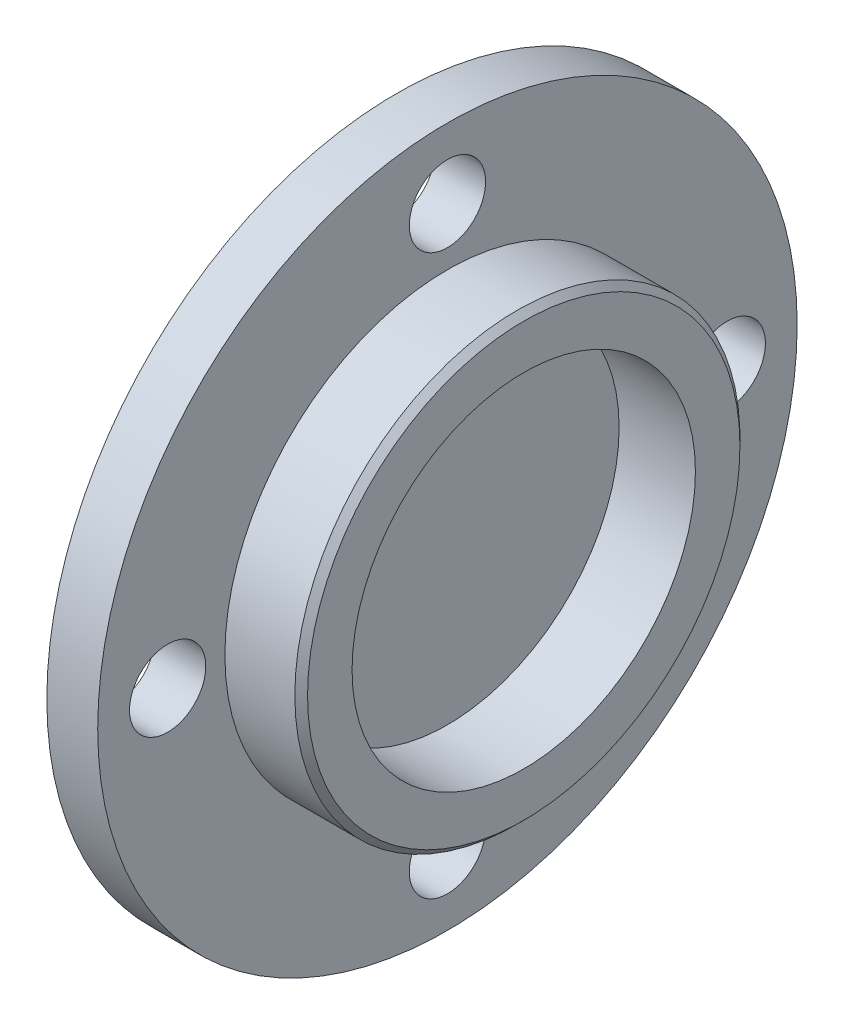
ISO-10303-21;
HEADER;
FILE_DESCRIPTION(('STEP AP214'),'2;1');
FILE_NAME('part.step','',(''),(''),'','','');
FILE_SCHEMA(('AUTOMOTIVE_DESIGN { 1 0 10303 214 1 1 1 1 }'));
ENDSEC;
DATA;
#1=APPLICATION_CONTEXT('core data for automotive mechanical design processes');
#2=APPLICATION_PROTOCOL_DEFINITION('international standard','automotive_design',2000,#1);
#3=PRODUCT_CONTEXT('',#1,'mechanical');
#4=PRODUCT('Part','Part','',(#3));
#5=PRODUCT_RELATED_PRODUCT_CATEGORY('part','',(#4));
#6=PRODUCT_DEFINITION_FORMATION('','',#4);
#7=PRODUCT_DEFINITION_CONTEXT('part definition',#1,'design');
#8=PRODUCT_DEFINITION('design','',#6,#7);
#9=PRODUCT_DEFINITION_SHAPE('','',#8);
#10=(LENGTH_UNIT() NAMED_UNIT(*) SI_UNIT(.MILLI.,.METRE.));
#11=(NAMED_UNIT(*) PLANE_ANGLE_UNIT() SI_UNIT($,.RADIAN.));
#12=(NAMED_UNIT(*) SI_UNIT($,.STERADIAN.) SOLID_ANGLE_UNIT());
#13=UNCERTAINTY_MEASURE_WITH_UNIT(LENGTH_MEASURE(1.E-05),#10,'distance_accuracy_value','');
#14=(GEOMETRIC_REPRESENTATION_CONTEXT(3) GLOBAL_UNCERTAINTY_ASSIGNED_CONTEXT((#13)) GLOBAL_UNIT_ASSIGNED_CONTEXT((#10,
#11,#12)) REPRESENTATION_CONTEXT('',''));
#15=CARTESIAN_POINT('',(0.,0.,0.));
#16=DIRECTION('',(0.,0.,1.));
#17=DIRECTION('',(1.,0.,0.));
#18=AXIS2_PLACEMENT_3D('',#15,#16,#17);
#19=CARTESIAN_POINT('',(0.,0.,0.));
#20=DIRECTION('',(1.,0.,0.));
#21=DIRECTION('',(0.,0.,-1.));
#22=AXIS2_PLACEMENT_3D('',#19,#20,#21);
#23=PLANE('',#22);
#24=CARTESIAN_POINT('',(0.,22.,0.));
#25=DIRECTION('',(-1.,0.,0.));
#26=DIRECTION('',(0.,0.,1.));
#27=AXIS2_PLACEMENT_3D('',#24,#25,#26);
#28=CIRCLE('',#27,3.);
#29=CARTESIAN_POINT('',(0.,22.,3.));
#30=VERTEX_POINT('',#29);
#31=EDGE_CURVE('E64',#30,#30,#28,.T.);
#32=ORIENTED_EDGE('',*,*,#31,.F.);
#33=EDGE_LOOP('',(#32));
#34=FACE_BOUND('',#33,.T.);
#35=CARTESIAN_POINT('',(0.,6.21236273031702E-13,22.0000000000006));
#36=DIRECTION('',(-1.,0.,0.));
#37=DIRECTION('',(0.,0.,1.));
#38=AXIS2_PLACEMENT_3D('',#35,#36,#37);
#39=CIRCLE('',#38,3.00000000000049);
#40=CARTESIAN_POINT('',(0.,6.21236273031702E-13,25.0000000000011));
#41=VERTEX_POINT('',#40);
#42=EDGE_CURVE('E134',#41,#41,#39,.T.);
#43=ORIENTED_EDGE('',*,*,#42,.F.);
#44=EDGE_LOOP('',(#43));
#45=FACE_BOUND('',#44,.T.);
#46=CARTESIAN_POINT('',(0.,-22.,1.2424725460634E-12));
#47=DIRECTION('',(-1.,0.,0.));
#48=DIRECTION('',(0.,0.,1.));
#49=AXIS2_PLACEMENT_3D('',#46,#47,#48);
#50=CIRCLE('',#49,3.00000000000133);
#51=CARTESIAN_POINT('',(0.,-22.,3.00000000000258));
#52=VERTEX_POINT('',#51);
#53=EDGE_CURVE('E138',#52,#52,#50,.T.);
#54=ORIENTED_EDGE('',*,*,#53,.F.);
#55=EDGE_LOOP('',(#54));
#56=FACE_BOUND('',#55,.T.);
#57=CARTESIAN_POINT('',(0.,-6.23930495989826E-13,-21.9999999999994));
#58=DIRECTION('',(-1.,0.,0.));
#59=DIRECTION('',(0.,0.,1.));
#60=AXIS2_PLACEMENT_3D('',#57,#58,#59);
#61=CIRCLE('',#60,3.000000000001);
#62=CARTESIAN_POINT('',(0.,-6.23930495989826E-13,-18.9999999999984));
#63=VERTEX_POINT('',#62);
#64=EDGE_CURVE('E88',#63,#63,#61,.T.);
#65=ORIENTED_EDGE('',*,*,#64,.F.);
#66=EDGE_LOOP('',(#65));
#67=FACE_BOUND('',#66,.T.);
#68=CARTESIAN_POINT('',(0.,0.,0.));
#69=DIRECTION('',(-1.,0.,0.));
#70=DIRECTION('',(0.,0.,1.));
#71=AXIS2_PLACEMENT_3D('',#68,#69,#70);
#72=CIRCLE('',#71,27.5);
#73=CARTESIAN_POINT('',(0.,0.,27.5));
#74=VERTEX_POINT('',#73);
#75=EDGE_CURVE('E55',#74,#74,#72,.T.);
#76=ORIENTED_EDGE('',*,*,#75,.T.);
#77=EDGE_LOOP('',(#76));
#78=FACE_BOUND('',#77,.T.);
#79=ADVANCED_FACE('F39',(#34,#45,#56,#67,#78),#23,.F.);
#80=CARTESIAN_POINT('',(0.,0.,0.));
#81=DIRECTION('',(-1.,0.,0.));
#82=DIRECTION('',(0.,0.,1.));
#83=AXIS2_PLACEMENT_3D('',#80,#81,#82);
#84=CYLINDRICAL_SURFACE('',#83,27.5);
#85=ORIENTED_EDGE('',*,*,#75,.F.);
#86=EDGE_LOOP('',(#85));
#87=FACE_BOUND('',#86,.T.);
#88=CARTESIAN_POINT('',(4.,0.,0.));
#89=DIRECTION('',(-1.,0.,0.));
#90=DIRECTION('',(0.,0.,1.));
#91=AXIS2_PLACEMENT_3D('',#88,#89,#90);
#92=CIRCLE('',#91,27.5);
#93=CARTESIAN_POINT('',(4.,0.,27.5));
#94=VERTEX_POINT('',#93);
#95=EDGE_CURVE('E94',#94,#94,#92,.T.);
#96=ORIENTED_EDGE('',*,*,#95,.T.);
#97=EDGE_LOOP('',(#96));
#98=FACE_BOUND('',#97,.T.);
#99=ADVANCED_FACE('F102',(#87,#98),#84,.T.);
#100=CARTESIAN_POINT('',(4.,0.,-27.5));
#101=DIRECTION('',(-1.,0.,0.));
#102=DIRECTION('',(0.,0.,1.));
#103=AXIS2_PLACEMENT_3D('',#100,#101,#102);
#104=PLANE('',#103);
#105=CARTESIAN_POINT('',(4.,22.,0.));
#106=DIRECTION('',(-1.,0.,0.));
#107=DIRECTION('',(0.,0.,1.));
#108=AXIS2_PLACEMENT_3D('',#105,#106,#107);
#109=CIRCLE('',#108,3.);
#110=CARTESIAN_POINT('',(4.,22.,3.));
#111=VERTEX_POINT('',#110);
#112=EDGE_CURVE('E44',#111,#111,#109,.T.);
#113=ORIENTED_EDGE('',*,*,#112,.T.);
#114=EDGE_LOOP('',(#113));
#115=FACE_BOUND('',#114,.T.);
#116=CARTESIAN_POINT('',(4.,6.21236273031702E-13,22.0000000000006));
#117=DIRECTION('',(-1.,0.,0.));
#118=DIRECTION('',(0.,0.,1.));
#119=AXIS2_PLACEMENT_3D('',#116,#117,#118);
#120=CIRCLE('',#119,3.00000000000049);
#121=CARTESIAN_POINT('',(4.,6.21236273031702E-13,25.0000000000011));
#122=VERTEX_POINT('',#121);
#123=EDGE_CURVE('E67',#122,#122,#120,.T.);
#124=ORIENTED_EDGE('',*,*,#123,.T.);
#125=EDGE_LOOP('',(#124));
#126=FACE_BOUND('',#125,.T.);
#127=CARTESIAN_POINT('',(4.,-22.,1.2424725460634E-12));
#128=DIRECTION('',(-1.,0.,0.));
#129=DIRECTION('',(0.,0.,1.));
#130=AXIS2_PLACEMENT_3D('',#127,#128,#129);
#131=CIRCLE('',#130,3.00000000000133);
#132=CARTESIAN_POINT('',(4.,-22.,3.00000000000258));
#133=VERTEX_POINT('',#132);
#134=EDGE_CURVE('E63',#133,#133,#131,.T.);
#135=ORIENTED_EDGE('',*,*,#134,.T.);
#136=EDGE_LOOP('',(#135));
#137=FACE_BOUND('',#136,.T.);
#138=CARTESIAN_POINT('',(4.,-6.23930495989826E-13,-21.9999999999994));
#139=DIRECTION('',(-1.,0.,0.));
#140=DIRECTION('',(0.,0.,1.));
#141=AXIS2_PLACEMENT_3D('',#138,#139,#140);
#142=CIRCLE('',#141,3.000000000001);
#143=CARTESIAN_POINT('',(4.,-6.23930495989826E-13,-18.9999999999984));
#144=VERTEX_POINT('',#143);
#145=EDGE_CURVE('E59',#144,#144,#142,.T.);
#146=ORIENTED_EDGE('',*,*,#145,.T.);
#147=EDGE_LOOP('',(#146));
#148=FACE_BOUND('',#147,.T.);
#149=ORIENTED_EDGE('',*,*,#95,.F.);
#150=EDGE_LOOP('',(#149));
#151=FACE_BOUND('',#150,.T.);
#152=CARTESIAN_POINT('',(4.,0.,0.));
#153=DIRECTION('',(-1.,0.,0.));
#154=DIRECTION('',(0.,0.,1.));
#155=AXIS2_PLACEMENT_3D('',#152,#153,#154);
#156=CIRCLE('',#155,17.5);
#157=CARTESIAN_POINT('',(4.,0.,17.5));
#158=VERTEX_POINT('',#157);
#159=EDGE_CURVE('E85',#158,#158,#156,.T.);
#160=ORIENTED_EDGE('',*,*,#159,.T.);
#161=EDGE_LOOP('',(#160));
#162=FACE_BOUND('',#161,.T.);
#163=ADVANCED_FACE('F105',(#115,#126,#137,#148,#151,#162),#104,.F.);
#164=CARTESIAN_POINT('',(0.,0.,0.));
#165=DIRECTION('',(-1.,0.,0.));
#166=DIRECTION('',(0.,0.,1.));
#167=AXIS2_PLACEMENT_3D('',#164,#165,#166);
#168=CYLINDRICAL_SURFACE('',#167,17.5);
#169=CARTESIAN_POINT('',(9.49999999999999,0.,0.));
#170=DIRECTION('',(-1.,0.,0.));
#171=DIRECTION('',(0.,0.,1.));
#172=AXIS2_PLACEMENT_3D('',#169,#170,#171);
#173=CIRCLE('',#172,17.5);
#174=CARTESIAN_POINT('',(9.49999999999999,0.,17.5));
#175=VERTEX_POINT('',#174);
#176=EDGE_CURVE('E49',#175,#175,#173,.T.);
#177=ORIENTED_EDGE('',*,*,#176,.T.);
#178=EDGE_LOOP('',(#177));
#179=FACE_BOUND('',#178,.T.);
#180=ORIENTED_EDGE('',*,*,#159,.F.);
#181=EDGE_LOOP('',(#180));
#182=FACE_BOUND('',#181,.T.);
#183=ADVANCED_FACE('F111',(#179,#182),#168,.T.);
#184=CARTESIAN_POINT('',(10.,0.,-17.5));
#185=DIRECTION('',(-1.,0.,0.));
#186=DIRECTION('',(0.,0.,1.));
#187=AXIS2_PLACEMENT_3D('',#184,#185,#186);
#188=PLANE('',#187);
#189=CARTESIAN_POINT('',(10.,0.,0.));
#190=DIRECTION('',(-1.,0.,0.));
#191=DIRECTION('',(0.,0.,1.));
#192=AXIS2_PLACEMENT_3D('',#189,#190,#191);
#193=CIRCLE('',#192,17.);
#194=CARTESIAN_POINT('',(10.,0.,17.));
#195=VERTEX_POINT('',#194);
#196=EDGE_CURVE('E10',#195,#195,#193,.F.);
#197=ORIENTED_EDGE('',*,*,#196,.T.);
#198=EDGE_LOOP('',(#197));
#199=FACE_BOUND('',#198,.T.);
#200=CARTESIAN_POINT('',(10.,0.,0.));
#201=DIRECTION('',(-1.,0.,0.));
#202=DIRECTION('',(0.,0.,1.));
#203=AXIS2_PLACEMENT_3D('',#200,#201,#202);
#204=CIRCLE('',#203,13.5);
#205=CARTESIAN_POINT('',(10.,0.,13.5));
#206=VERTEX_POINT('',#205);
#207=EDGE_CURVE('E79',#206,#206,#204,.T.);
#208=ORIENTED_EDGE('',*,*,#207,.T.);
#209=EDGE_LOOP('',(#208));
#210=FACE_BOUND('',#209,.T.);
#211=ADVANCED_FACE('F116',(#199,#210),#188,.F.);
#212=CARTESIAN_POINT('',(0.,0.,0.));
#213=DIRECTION('',(-1.,0.,0.));
#214=DIRECTION('',(0.,0.,1.));
#215=AXIS2_PLACEMENT_3D('',#212,#213,#214);
#216=CYLINDRICAL_SURFACE('',#215,13.5);
#217=ORIENTED_EDGE('',*,*,#207,.F.);
#218=EDGE_LOOP('',(#217));
#219=FACE_BOUND('',#218,.T.);
#220=CARTESIAN_POINT('',(4.,0.,0.));
#221=DIRECTION('',(-1.,0.,0.));
#222=DIRECTION('',(0.,0.,1.));
#223=AXIS2_PLACEMENT_3D('',#220,#221,#222);
#224=CIRCLE('',#223,13.5);
#225=CARTESIAN_POINT('',(4.,0.,13.5));
#226=VERTEX_POINT('',#225);
#227=EDGE_CURVE('E74',#226,#226,#224,.T.);
#228=ORIENTED_EDGE('',*,*,#227,.T.);
#229=EDGE_LOOP('',(#228));
#230=FACE_BOUND('',#229,.T.);
#231=ADVANCED_FACE('F122',(#219,#230),#216,.F.);
#232=CARTESIAN_POINT('',(4.,0.,-13.5));
#233=DIRECTION('',(-1.,0.,0.));
#234=DIRECTION('',(0.,0.,1.));
#235=AXIS2_PLACEMENT_3D('',#232,#233,#234);
#236=PLANE('',#235);
#237=ORIENTED_EDGE('',*,*,#227,.F.);
#238=EDGE_LOOP('',(#237));
#239=FACE_BOUND('',#238,.T.);
#240=ADVANCED_FACE('F167',(#239),#236,.F.);
#241=CARTESIAN_POINT('',(9.49999999999999,0.,0.));
#242=DIRECTION('',(-1.,0.,0.));
#243=DIRECTION('',(0.,0.,1.));
#244=AXIS2_PLACEMENT_3D('',#241,#242,#243);
#245=CONICAL_SURFACE('',#244,17.5,0.785398163397455);
#246=ORIENTED_EDGE('',*,*,#196,.F.);
#247=EDGE_LOOP('',(#246));
#248=FACE_BOUND('',#247,.T.);
#249=ORIENTED_EDGE('',*,*,#176,.F.);
#250=EDGE_LOOP('',(#249));
#251=FACE_BOUND('',#250,.T.);
#252=ADVANCED_FACE('F42',(#248,#251),#245,.T.);
#253=CARTESIAN_POINT('',(10.,-6.23930495989826E-13,-21.9999999999994));
#254=DIRECTION('',(-1.,0.,0.));
#255=DIRECTION('',(0.,0.,1.));
#256=AXIS2_PLACEMENT_3D('',#253,#254,#255);
#257=CYLINDRICAL_SURFACE('',#256,3.000000000001);
#258=ORIENTED_EDGE('',*,*,#64,.T.);
#259=EDGE_LOOP('',(#258));
#260=FACE_BOUND('',#259,.T.);
#261=ORIENTED_EDGE('',*,*,#145,.F.);
#262=EDGE_LOOP('',(#261));
#263=FACE_BOUND('',#262,.T.);
#264=ADVANCED_FACE('F164',(#260,#263),#257,.F.);
#265=CARTESIAN_POINT('',(10.,-22.,1.2424725460634E-12));
#266=DIRECTION('',(-1.,0.,0.));
#267=DIRECTION('',(0.,0.,1.));
#268=AXIS2_PLACEMENT_3D('',#265,#266,#267);
#269=CYLINDRICAL_SURFACE('',#268,3.00000000000133);
#270=ORIENTED_EDGE('',*,*,#53,.T.);
#271=EDGE_LOOP('',(#270));
#272=FACE_BOUND('',#271,.T.);
#273=ORIENTED_EDGE('',*,*,#134,.F.);
#274=EDGE_LOOP('',(#273));
#275=FACE_BOUND('',#274,.T.);
#276=ADVANCED_FACE('F158',(#272,#275),#269,.F.);
#277=CARTESIAN_POINT('',(10.,6.21236273031702E-13,22.0000000000006));
#278=DIRECTION('',(-1.,0.,0.));
#279=DIRECTION('',(0.,0.,1.));
#280=AXIS2_PLACEMENT_3D('',#277,#278,#279);
#281=CYLINDRICAL_SURFACE('',#280,3.00000000000049);
#282=ORIENTED_EDGE('',*,*,#42,.T.);
#283=EDGE_LOOP('',(#282));
#284=FACE_BOUND('',#283,.T.);
#285=ORIENTED_EDGE('',*,*,#123,.F.);
#286=EDGE_LOOP('',(#285));
#287=FACE_BOUND('',#286,.T.);
#288=ADVANCED_FACE('F153',(#284,#287),#281,.F.);
#289=CARTESIAN_POINT('',(10.,22.,0.));
#290=DIRECTION('',(-1.,0.,0.));
#291=DIRECTION('',(0.,0.,1.));
#292=AXIS2_PLACEMENT_3D('',#289,#290,#291);
#293=CYLINDRICAL_SURFACE('',#292,3.);
#294=ORIENTED_EDGE('',*,*,#31,.T.);
#295=EDGE_LOOP('',(#294));
#296=FACE_BOUND('',#295,.T.);
#297=ORIENTED_EDGE('',*,*,#112,.F.);
#298=EDGE_LOOP('',(#297));
#299=FACE_BOUND('',#298,.T.);
#300=ADVANCED_FACE('F150',(#296,#299),#293,.F.);
#301=CLOSED_SHELL('',(#79,#99,#163,#183,#211,#231,#240,#252,#264,#276,#288,#300));
#302=MANIFOLD_SOLID_BREP('B2',#301);
#303=ADVANCED_BREP_SHAPE_REPRESENTATION('',(#18,#302),#14);
#304=SHAPE_DEFINITION_REPRESENTATION(#9,#303);
ENDSEC;
END-ISO-10303-21;
